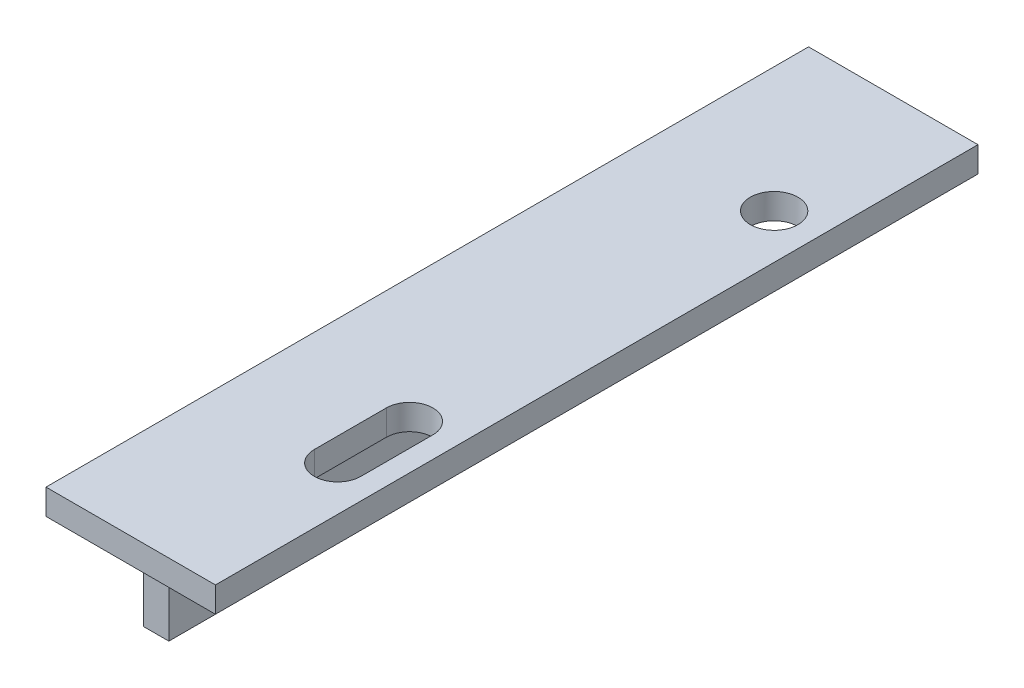
ISO-10303-21;
HEADER;
FILE_DESCRIPTION(('STEP AP214'),'2;1');
FILE_NAME('part.step','',(''),(''),'','','');
FILE_SCHEMA(('AUTOMOTIVE_DESIGN { 1 0 10303 214 1 1 1 1 }'));
ENDSEC;
DATA;
#1=APPLICATION_CONTEXT('core data for automotive mechanical design processes');
#2=APPLICATION_PROTOCOL_DEFINITION('international standard','automotive_design',2000,#1);
#3=PRODUCT_CONTEXT('',#1,'mechanical');
#4=PRODUCT('Part','Part','',(#3));
#5=PRODUCT_RELATED_PRODUCT_CATEGORY('part','',(#4));
#6=PRODUCT_DEFINITION_FORMATION('','',#4);
#7=PRODUCT_DEFINITION_CONTEXT('part definition',#1,'design');
#8=PRODUCT_DEFINITION('design','',#6,#7);
#9=PRODUCT_DEFINITION_SHAPE('','',#8);
#10=(LENGTH_UNIT() NAMED_UNIT(*) SI_UNIT(.MILLI.,.METRE.));
#11=(NAMED_UNIT(*) PLANE_ANGLE_UNIT() SI_UNIT($,.RADIAN.));
#12=(NAMED_UNIT(*) SI_UNIT($,.STERADIAN.) SOLID_ANGLE_UNIT());
#13=UNCERTAINTY_MEASURE_WITH_UNIT(LENGTH_MEASURE(1.E-05),#10,'distance_accuracy_value','');
#14=(GEOMETRIC_REPRESENTATION_CONTEXT(3) GLOBAL_UNCERTAINTY_ASSIGNED_CONTEXT((#13)) GLOBAL_UNIT_ASSIGNED_CONTEXT((#10,
#11,#12)) REPRESENTATION_CONTEXT('',''));
#15=CARTESIAN_POINT('',(0.,0.,0.));
#16=DIRECTION('',(0.,0.,1.));
#17=DIRECTION('',(1.,0.,0.));
#18=AXIS2_PLACEMENT_3D('',#15,#16,#17);
#19=CARTESIAN_POINT('',(0.,0.,-180.));
#20=DIRECTION('',(-1.,0.,0.));
#21=DIRECTION('',(0.,-1.,0.));
#22=AXIS2_PLACEMENT_3D('',#19,#20,#21);
#23=PLANE('',#22);
#24=DIRECTION('',(0.,0.,-1.));
#25=VECTOR('',#24,1.);
#26=CARTESIAN_POINT('',(0.,-6.,-180.));
#27=LINE('',#26,#25);
#28=CARTESIAN_POINT('',(0.,-6.,0.));
#29=VERTEX_POINT('',#28);
#30=CARTESIAN_POINT('',(0.,-6.,-23.));
#31=VERTEX_POINT('',#30);
#32=EDGE_CURVE('E164',#29,#31,#27,.T.);
#33=ORIENTED_EDGE('',*,*,#32,.F.);
#34=DIRECTION('',(0.,-1.,0.));
#35=VECTOR('',#34,1.);
#36=CARTESIAN_POINT('',(0.,0.,0.));
#37=LINE('',#36,#35);
#38=CARTESIAN_POINT('',(0.,0.,0.));
#39=VERTEX_POINT('',#38);
#40=EDGE_CURVE('E180',#39,#29,#37,.T.);
#41=ORIENTED_EDGE('',*,*,#40,.F.);
#42=DIRECTION('',(0.,0.,1.));
#43=VECTOR('',#42,1.);
#44=CARTESIAN_POINT('',(0.,0.,-180.));
#45=LINE('',#44,#43);
#46=CARTESIAN_POINT('',(0.,0.,-180.));
#47=VERTEX_POINT('',#46);
#48=EDGE_CURVE('E205',#47,#39,#45,.T.);
#49=ORIENTED_EDGE('',*,*,#48,.F.);
#50=DIRECTION('',(0.,-1.,0.));
#51=VECTOR('',#50,1.);
#52=CARTESIAN_POINT('',(0.,0.,-180.));
#53=LINE('',#52,#51);
#54=CARTESIAN_POINT('',(0.,-6.,-180.));
#55=VERTEX_POINT('',#54);
#56=EDGE_CURVE('E181',#47,#55,#53,.T.);
#57=ORIENTED_EDGE('',*,*,#56,.T.);
#58=DIRECTION('',(0.,0.,-1.));
#59=VECTOR('',#58,1.);
#60=CARTESIAN_POINT('',(0.,-6.,-180.));
#61=LINE('',#60,#59);
#62=CARTESIAN_POINT('',(0.,-6.,-157.));
#63=VERTEX_POINT('',#62);
#64=EDGE_CURVE('E173',#63,#55,#61,.T.);
#65=ORIENTED_EDGE('',*,*,#64,.F.);
#66=DIRECTION('',(0.,1.,0.));
#67=VECTOR('',#66,1.);
#68=CARTESIAN_POINT('',(0.,0.,-157.));
#69=LINE('',#68,#67);
#70=CARTESIAN_POINT('',(0.,-40.,-157.));
#71=VERTEX_POINT('',#70);
#72=EDGE_CURVE('E176',#71,#63,#69,.T.);
#73=ORIENTED_EDGE('',*,*,#72,.F.);
#74=DIRECTION('',(0.,0.,1.));
#75=VECTOR('',#74,1.);
#76=CARTESIAN_POINT('',(0.,-40.,-180.));
#77=LINE('',#76,#75);
#78=CARTESIAN_POINT('',(0.,-40.,-23.));
#79=VERTEX_POINT('',#78);
#80=EDGE_CURVE('E194',#71,#79,#77,.T.);
#81=ORIENTED_EDGE('',*,*,#80,.T.);
#82=DIRECTION('',(0.,-1.,0.));
#83=VECTOR('',#82,1.);
#84=CARTESIAN_POINT('',(0.,0.,-23.));
#85=LINE('',#84,#83);
#86=EDGE_CURVE('E178',#31,#79,#85,.T.);
#87=ORIENTED_EDGE('',*,*,#86,.F.);
#88=EDGE_LOOP('',(#33,#41,#49,#57,#65,#73,#81,#87));
#89=FACE_BOUND('',#88,.T.);
#90=ADVANCED_FACE('F41',(#89),#23,.T.);
#91=CARTESIAN_POINT('',(0.,0.,-180.));
#92=DIRECTION('',(0.,1.,0.));
#93=DIRECTION('',(0.,0.,1.));
#94=AXIS2_PLACEMENT_3D('',#91,#92,#93);
#95=PLANE('',#94);
#96=CARTESIAN_POINT('',(29.48,0.,-142.4));
#97=DIRECTION('',(0.,1.,0.));
#98=DIRECTION('',(0.,0.,1.));
#99=AXIS2_PLACEMENT_3D('',#96,#97,#98);
#100=CIRCLE('',#99,5.625);
#101=CARTESIAN_POINT('',(29.48,0.,-136.775));
#102=VERTEX_POINT('',#101);
#103=EDGE_CURVE('E150',#102,#102,#100,.T.);
#104=ORIENTED_EDGE('',*,*,#103,.F.);
#105=EDGE_LOOP('',(#104));
#106=FACE_BOUND('',#105,.T.);
#107=CARTESIAN_POINT('',(29.48,0.,-56.35));
#108=DIRECTION('',(0.,1.,0.));
#109=DIRECTION('',(0.,0.,1.));
#110=AXIS2_PLACEMENT_3D('',#107,#108,#109);
#111=CIRCLE('',#110,5.5);
#112=CARTESIAN_POINT('',(34.98,0.,-56.35));
#113=VERTEX_POINT('',#112);
#114=CARTESIAN_POINT('',(23.98,0.,-56.35));
#115=VERTEX_POINT('',#114);
#116=EDGE_CURVE('E56',#113,#115,#111,.T.);
#117=ORIENTED_EDGE('',*,*,#116,.F.);
#118=DIRECTION('',(0.,0.,-1.));
#119=VECTOR('',#118,1.);
#120=CARTESIAN_POINT('',(34.98,0.,-56.35));
#121=LINE('',#120,#119);
#122=CARTESIAN_POINT('',(34.98,0.,-39.35));
#123=VERTEX_POINT('',#122);
#124=EDGE_CURVE('E137',#123,#113,#121,.T.);
#125=ORIENTED_EDGE('',*,*,#124,.F.);
#126=CARTESIAN_POINT('',(29.48,0.,-39.35));
#127=DIRECTION('',(0.,1.,0.));
#128=DIRECTION('',(0.,0.,1.));
#129=AXIS2_PLACEMENT_3D('',#126,#127,#128);
#130=CIRCLE('',#129,5.5);
#131=CARTESIAN_POINT('',(23.98,0.,-39.35));
#132=VERTEX_POINT('',#131);
#133=EDGE_CURVE('E143',#132,#123,#130,.T.);
#134=ORIENTED_EDGE('',*,*,#133,.F.);
#135=DIRECTION('',(0.,0.,1.));
#136=VECTOR('',#135,1.);
#137=CARTESIAN_POINT('',(23.98,0.,-56.35));
#138=LINE('',#137,#136);
#139=EDGE_CURVE('E149',#115,#132,#138,.T.);
#140=ORIENTED_EDGE('',*,*,#139,.F.);
#141=EDGE_LOOP('',(#117,#125,#134,#140));
#142=FACE_BOUND('',#141,.T.);
#143=DIRECTION('',(-1.,0.,0.));
#144=VECTOR('',#143,1.);
#145=CARTESIAN_POINT('',(0.,0.,0.));
#146=LINE('',#145,#144);
#147=CARTESIAN_POINT('',(40.,0.,0.));
#148=VERTEX_POINT('',#147);
#149=EDGE_CURVE('E185',#148,#39,#146,.T.);
#150=ORIENTED_EDGE('',*,*,#149,.F.);
#151=DIRECTION('',(0.,0.,1.));
#152=VECTOR('',#151,1.);
#153=CARTESIAN_POINT('',(40.,0.,-180.));
#154=LINE('',#153,#152);
#155=CARTESIAN_POINT('',(40.,0.,-180.));
#156=VERTEX_POINT('',#155);
#157=EDGE_CURVE('E208',#156,#148,#154,.T.);
#158=ORIENTED_EDGE('',*,*,#157,.F.);
#159=DIRECTION('',(-1.,0.,0.));
#160=VECTOR('',#159,1.);
#161=CARTESIAN_POINT('',(0.,0.,-180.));
#162=LINE('',#161,#160);
#163=EDGE_CURVE('E191',#156,#47,#162,.T.);
#164=ORIENTED_EDGE('',*,*,#163,.T.);
#165=ORIENTED_EDGE('',*,*,#48,.T.);
#166=EDGE_LOOP('',(#150,#158,#164,#165));
#167=FACE_BOUND('',#166,.T.);
#168=ADVANCED_FACE('F147',(#106,#142,#167),#95,.T.);
#169=CARTESIAN_POINT('',(40.,0.,-180.));
#170=DIRECTION('',(1.,0.,0.));
#171=DIRECTION('',(0.,0.,-1.));
#172=AXIS2_PLACEMENT_3D('',#169,#170,#171);
#173=PLANE('',#172);
#174=DIRECTION('',(0.,1.,0.));
#175=VECTOR('',#174,1.);
#176=CARTESIAN_POINT('',(40.,0.,0.));
#177=LINE('',#176,#175);
#178=CARTESIAN_POINT('',(40.,-6.,0.));
#179=VERTEX_POINT('',#178);
#180=EDGE_CURVE('E200',#179,#148,#177,.T.);
#181=ORIENTED_EDGE('',*,*,#180,.F.);
#182=DIRECTION('',(0.,0.,1.));
#183=VECTOR('',#182,1.);
#184=CARTESIAN_POINT('',(40.,-6.,-180.));
#185=LINE('',#184,#183);
#186=CARTESIAN_POINT('',(40.,-6.,-180.));
#187=VERTEX_POINT('',#186);
#188=EDGE_CURVE('E210',#187,#179,#185,.T.);
#189=ORIENTED_EDGE('',*,*,#188,.F.);
#190=DIRECTION('',(0.,1.,0.));
#191=VECTOR('',#190,1.);
#192=CARTESIAN_POINT('',(40.,0.,-180.));
#193=LINE('',#192,#191);
#194=EDGE_CURVE('E188',#187,#156,#193,.T.);
#195=ORIENTED_EDGE('',*,*,#194,.T.);
#196=ORIENTED_EDGE('',*,*,#157,.T.);
#197=EDGE_LOOP('',(#181,#189,#195,#196));
#198=FACE_BOUND('',#197,.T.);
#199=ADVANCED_FACE('F252',(#198),#173,.T.);
#200=CARTESIAN_POINT('',(6.,-6.,-180.));
#201=DIRECTION('',(0.,-1.,0.));
#202=DIRECTION('',(0.,0.,-1.));
#203=AXIS2_PLACEMENT_3D('',#200,#201,#202);
#204=PLANE('',#203);
#205=CARTESIAN_POINT('',(29.48,-6.,-142.4));
#206=DIRECTION('',(0.,-1.,0.));
#207=DIRECTION('',(0.,0.,-1.));
#208=AXIS2_PLACEMENT_3D('',#205,#206,#207);
#209=CIRCLE('',#208,5.625);
#210=CARTESIAN_POINT('',(29.48,-6.,-148.025));
#211=VERTEX_POINT('',#210);
#212=EDGE_CURVE('E44',#211,#211,#209,.T.);
#213=ORIENTED_EDGE('',*,*,#212,.F.);
#214=EDGE_LOOP('',(#213));
#215=FACE_BOUND('',#214,.T.);
#216=CARTESIAN_POINT('',(29.48,-6.,-56.35));
#217=DIRECTION('',(0.,-1.,0.));
#218=DIRECTION('',(0.,0.,-1.));
#219=AXIS2_PLACEMENT_3D('',#216,#217,#218);
#220=CIRCLE('',#219,5.5);
#221=CARTESIAN_POINT('',(23.98,-6.,-56.35));
#222=VERTEX_POINT('',#221);
#223=CARTESIAN_POINT('',(34.98,-6.,-56.35));
#224=VERTEX_POINT('',#223);
#225=EDGE_CURVE('E11',#222,#224,#220,.T.);
#226=ORIENTED_EDGE('',*,*,#225,.F.);
#227=DIRECTION('',(0.,0.,-1.));
#228=VECTOR('',#227,1.);
#229=CARTESIAN_POINT('',(23.98,-6.,-180.));
#230=LINE('',#229,#228);
#231=CARTESIAN_POINT('',(23.98,-6.,-39.35));
#232=VERTEX_POINT('',#231);
#233=EDGE_CURVE('E207',#232,#222,#230,.T.);
#234=ORIENTED_EDGE('',*,*,#233,.F.);
#235=CARTESIAN_POINT('',(29.48,-6.,-39.35));
#236=DIRECTION('',(0.,-1.,0.));
#237=DIRECTION('',(0.,0.,-1.));
#238=AXIS2_PLACEMENT_3D('',#235,#236,#237);
#239=CIRCLE('',#238,5.5);
#240=CARTESIAN_POINT('',(34.98,-6.,-39.35));
#241=VERTEX_POINT('',#240);
#242=EDGE_CURVE('E221',#241,#232,#239,.T.);
#243=ORIENTED_EDGE('',*,*,#242,.F.);
#244=DIRECTION('',(0.,0.,1.));
#245=VECTOR('',#244,1.);
#246=CARTESIAN_POINT('',(34.98,-6.,-180.));
#247=LINE('',#246,#245);
#248=EDGE_CURVE('E49',#224,#241,#247,.T.);
#249=ORIENTED_EDGE('',*,*,#248,.F.);
#250=EDGE_LOOP('',(#226,#234,#243,#249));
#251=FACE_BOUND('',#250,.T.);
#252=DIRECTION('',(1.,0.,0.));
#253=VECTOR('',#252,1.);
#254=CARTESIAN_POINT('',(6.,-6.,0.));
#255=LINE('',#254,#253);
#256=EDGE_CURVE('E197',#29,#179,#255,.T.);
#257=ORIENTED_EDGE('',*,*,#256,.F.);
#258=ORIENTED_EDGE('',*,*,#32,.T.);
#259=DIRECTION('',(1.,0.,0.));
#260=VECTOR('',#259,1.);
#261=CARTESIAN_POINT('',(-4.,-6.,-23.));
#262=LINE('',#261,#260);
#263=CARTESIAN_POINT('',(6.,-6.,-23.));
#264=VERTEX_POINT('',#263);
#265=EDGE_CURVE('E162',#31,#264,#262,.T.);
#266=ORIENTED_EDGE('',*,*,#265,.T.);
#267=DIRECTION('',(0.,0.,1.));
#268=VECTOR('',#267,1.);
#269=CARTESIAN_POINT('',(6.,-6.,-180.));
#270=LINE('',#269,#268);
#271=CARTESIAN_POINT('',(6.,-6.,-157.));
#272=VERTEX_POINT('',#271);
#273=EDGE_CURVE('E212',#272,#264,#270,.T.);
#274=ORIENTED_EDGE('',*,*,#273,.F.);
#275=DIRECTION('',(1.,0.,0.));
#276=VECTOR('',#275,1.);
#277=CARTESIAN_POINT('',(-4.,-6.,-157.));
#278=LINE('',#277,#276);
#279=EDGE_CURVE('E166',#63,#272,#278,.T.);
#280=ORIENTED_EDGE('',*,*,#279,.F.);
#281=ORIENTED_EDGE('',*,*,#64,.T.);
#282=DIRECTION('',(1.,0.,0.));
#283=VECTOR('',#282,1.);
#284=CARTESIAN_POINT('',(6.,-6.,-180.));
#285=LINE('',#284,#283);
#286=EDGE_CURVE('E184',#55,#187,#285,.T.);
#287=ORIENTED_EDGE('',*,*,#286,.T.);
#288=ORIENTED_EDGE('',*,*,#188,.T.);
#289=EDGE_LOOP('',(#257,#258,#266,#274,#280,#281,#287,#288));
#290=FACE_BOUND('',#289,.T.);
#291=ADVANCED_FACE('F229',(#215,#251,#290),#204,.T.);
#292=CARTESIAN_POINT('',(6.,-6.,-180.));
#293=DIRECTION('',(1.,0.,0.));
#294=DIRECTION('',(0.,0.,-1.));
#295=AXIS2_PLACEMENT_3D('',#292,#293,#294);
#296=PLANE('',#295);
#297=DIRECTION('',(0.,1.,0.));
#298=VECTOR('',#297,1.);
#299=CARTESIAN_POINT('',(6.,-6.,-23.));
#300=LINE('',#299,#298);
#301=CARTESIAN_POINT('',(6.,-40.,-23.));
#302=VERTEX_POINT('',#301);
#303=EDGE_CURVE('E157',#302,#264,#300,.T.);
#304=ORIENTED_EDGE('',*,*,#303,.F.);
#305=DIRECTION('',(0.,0.,1.));
#306=VECTOR('',#305,1.);
#307=CARTESIAN_POINT('',(6.,-40.,-180.));
#308=LINE('',#307,#306);
#309=CARTESIAN_POINT('',(6.,-40.,-157.));
#310=VERTEX_POINT('',#309);
#311=EDGE_CURVE('E215',#310,#302,#308,.T.);
#312=ORIENTED_EDGE('',*,*,#311,.F.);
#313=DIRECTION('',(0.,-1.,0.));
#314=VECTOR('',#313,1.);
#315=CARTESIAN_POINT('',(6.,-6.,-157.));
#316=LINE('',#315,#314);
#317=EDGE_CURVE('E161',#272,#310,#316,.T.);
#318=ORIENTED_EDGE('',*,*,#317,.F.);
#319=ORIENTED_EDGE('',*,*,#273,.T.);
#320=EDGE_LOOP('',(#304,#312,#318,#319));
#321=FACE_BOUND('',#320,.T.);
#322=ADVANCED_FACE('F282',(#321),#296,.T.);
#323=CARTESIAN_POINT('',(6.,-40.,-180.));
#324=DIRECTION('',(0.,-1.,0.));
#325=DIRECTION('',(0.,0.,-1.));
#326=AXIS2_PLACEMENT_3D('',#323,#324,#325);
#327=PLANE('',#326);
#328=DIRECTION('',(1.,0.,0.));
#329=VECTOR('',#328,1.);
#330=CARTESIAN_POINT('',(-4.,-40.,-23.));
#331=LINE('',#330,#329);
#332=EDGE_CURVE('E160',#79,#302,#331,.T.);
#333=ORIENTED_EDGE('',*,*,#332,.F.);
#334=ORIENTED_EDGE('',*,*,#80,.F.);
#335=DIRECTION('',(1.,0.,0.));
#336=VECTOR('',#335,1.);
#337=CARTESIAN_POINT('',(-4.,-40.,-157.));
#338=LINE('',#337,#336);
#339=EDGE_CURVE('E168',#71,#310,#338,.T.);
#340=ORIENTED_EDGE('',*,*,#339,.T.);
#341=ORIENTED_EDGE('',*,*,#311,.T.);
#342=EDGE_LOOP('',(#333,#334,#340,#341));
#343=FACE_BOUND('',#342,.T.);
#344=ADVANCED_FACE('F276',(#343),#327,.T.);
#345=CARTESIAN_POINT('',(0.,0.,-180.));
#346=DIRECTION('',(0.,0.,-1.));
#347=DIRECTION('',(-1.,0.,0.));
#348=AXIS2_PLACEMENT_3D('',#345,#346,#347);
#349=PLANE('',#348);
#350=ORIENTED_EDGE('',*,*,#286,.F.);
#351=ORIENTED_EDGE('',*,*,#56,.F.);
#352=ORIENTED_EDGE('',*,*,#163,.F.);
#353=ORIENTED_EDGE('',*,*,#194,.F.);
#354=EDGE_LOOP('',(#350,#351,#352,#353));
#355=FACE_BOUND('',#354,.T.);
#356=ADVANCED_FACE('F267',(#355),#349,.T.);
#357=CARTESIAN_POINT('',(0.,0.,0.));
#358=DIRECTION('',(0.,0.,-1.));
#359=DIRECTION('',(-1.,0.,0.));
#360=AXIS2_PLACEMENT_3D('',#357,#358,#359);
#361=PLANE('',#360);
#362=ORIENTED_EDGE('',*,*,#40,.T.);
#363=ORIENTED_EDGE('',*,*,#256,.T.);
#364=ORIENTED_EDGE('',*,*,#180,.T.);
#365=ORIENTED_EDGE('',*,*,#149,.T.);
#366=EDGE_LOOP('',(#362,#363,#364,#365));
#367=FACE_BOUND('',#366,.T.);
#368=ADVANCED_FACE('F260',(#367),#361,.F.);
#369=CARTESIAN_POINT('',(-4.,-6.,-23.));
#370=DIRECTION('',(0.,0.,-1.));
#371=DIRECTION('',(0.,1.,0.));
#372=AXIS2_PLACEMENT_3D('',#369,#370,#371);
#373=PLANE('',#372);
#374=ORIENTED_EDGE('',*,*,#86,.T.);
#375=ORIENTED_EDGE('',*,*,#332,.T.);
#376=ORIENTED_EDGE('',*,*,#303,.T.);
#377=ORIENTED_EDGE('',*,*,#265,.F.);
#378=EDGE_LOOP('',(#374,#375,#376,#377));
#379=FACE_BOUND('',#378,.T.);
#380=ADVANCED_FACE('F280',(#379),#373,.F.);
#381=CARTESIAN_POINT('',(-4.,-6.,-157.));
#382=DIRECTION('',(0.,0.,1.));
#383=DIRECTION('',(1.,0.,0.));
#384=AXIS2_PLACEMENT_3D('',#381,#382,#383);
#385=PLANE('',#384);
#386=ORIENTED_EDGE('',*,*,#72,.T.);
#387=ORIENTED_EDGE('',*,*,#279,.T.);
#388=ORIENTED_EDGE('',*,*,#317,.T.);
#389=ORIENTED_EDGE('',*,*,#339,.F.);
#390=EDGE_LOOP('',(#386,#387,#388,#389));
#391=FACE_BOUND('',#390,.T.);
#392=ADVANCED_FACE('F284',(#391),#385,.F.);
#393=CARTESIAN_POINT('',(29.48,-10.,-56.35));
#394=DIRECTION('',(0.,1.,0.));
#395=DIRECTION('',(0.,0.,1.));
#396=AXIS2_PLACEMENT_3D('',#393,#394,#395);
#397=CYLINDRICAL_SURFACE('',#396,5.5);
#398=ORIENTED_EDGE('',*,*,#225,.T.);
#399=DIRECTION('',(0.,1.,0.));
#400=VECTOR('',#399,1.);
#401=CARTESIAN_POINT('',(34.98,-10.,-56.35));
#402=LINE('',#401,#400);
#403=EDGE_CURVE('E128',#224,#113,#402,.T.);
#404=ORIENTED_EDGE('',*,*,#403,.T.);
#405=ORIENTED_EDGE('',*,*,#116,.T.);
#406=DIRECTION('',(0.,1.,0.));
#407=VECTOR('',#406,1.);
#408=CARTESIAN_POINT('',(23.98,-10.,-56.35));
#409=LINE('',#408,#407);
#410=EDGE_CURVE('E144',#222,#115,#409,.T.);
#411=ORIENTED_EDGE('',*,*,#410,.F.);
#412=EDGE_LOOP('',(#398,#404,#405,#411));
#413=FACE_BOUND('',#412,.T.);
#414=ADVANCED_FACE('F130',(#413),#397,.F.);
#415=CARTESIAN_POINT('',(34.98,-10.,-56.35));
#416=DIRECTION('',(1.,0.,0.));
#417=DIRECTION('',(0.,0.,-1.));
#418=AXIS2_PLACEMENT_3D('',#415,#416,#417);
#419=PLANE('',#418);
#420=ORIENTED_EDGE('',*,*,#248,.T.);
#421=DIRECTION('',(0.,1.,0.));
#422=VECTOR('',#421,1.);
#423=CARTESIAN_POINT('',(34.98,-10.,-39.35));
#424=LINE('',#423,#422);
#425=EDGE_CURVE('E134',#241,#123,#424,.T.);
#426=ORIENTED_EDGE('',*,*,#425,.T.);
#427=ORIENTED_EDGE('',*,*,#124,.T.);
#428=ORIENTED_EDGE('',*,*,#403,.F.);
#429=EDGE_LOOP('',(#420,#426,#427,#428));
#430=FACE_BOUND('',#429,.T.);
#431=ADVANCED_FACE('F138',(#430),#419,.F.);
#432=CARTESIAN_POINT('',(29.48,-10.,-39.35));
#433=DIRECTION('',(0.,1.,0.));
#434=DIRECTION('',(0.,0.,1.));
#435=AXIS2_PLACEMENT_3D('',#432,#433,#434);
#436=CYLINDRICAL_SURFACE('',#435,5.5);
#437=ORIENTED_EDGE('',*,*,#242,.T.);
#438=DIRECTION('',(0.,1.,0.));
#439=VECTOR('',#438,1.);
#440=CARTESIAN_POINT('',(23.98,-10.,-39.35));
#441=LINE('',#440,#439);
#442=EDGE_CURVE('E64',#232,#132,#441,.T.);
#443=ORIENTED_EDGE('',*,*,#442,.T.);
#444=ORIENTED_EDGE('',*,*,#133,.T.);
#445=ORIENTED_EDGE('',*,*,#425,.F.);
#446=EDGE_LOOP('',(#437,#443,#444,#445));
#447=FACE_BOUND('',#446,.T.);
#448=ADVANCED_FACE('F226',(#447),#436,.F.);
#449=CARTESIAN_POINT('',(23.98,-10.,-56.35));
#450=DIRECTION('',(-1.,0.,0.));
#451=DIRECTION('',(0.,0.,1.));
#452=AXIS2_PLACEMENT_3D('',#449,#450,#451);
#453=PLANE('',#452);
#454=ORIENTED_EDGE('',*,*,#233,.T.);
#455=ORIENTED_EDGE('',*,*,#410,.T.);
#456=ORIENTED_EDGE('',*,*,#139,.T.);
#457=ORIENTED_EDGE('',*,*,#442,.F.);
#458=EDGE_LOOP('',(#454,#455,#456,#457));
#459=FACE_BOUND('',#458,.T.);
#460=ADVANCED_FACE('F231',(#459),#453,.F.);
#461=CARTESIAN_POINT('',(29.48,-10.,-142.4));
#462=DIRECTION('',(0.,1.,0.));
#463=DIRECTION('',(0.,0.,1.));
#464=AXIS2_PLACEMENT_3D('',#461,#462,#463);
#465=CYLINDRICAL_SURFACE('',#464,5.625);
#466=ORIENTED_EDGE('',*,*,#212,.T.);
#467=EDGE_LOOP('',(#466));
#468=FACE_BOUND('',#467,.T.);
#469=ORIENTED_EDGE('',*,*,#103,.T.);
#470=EDGE_LOOP('',(#469));
#471=FACE_BOUND('',#470,.T.);
#472=ADVANCED_FACE('F235',(#468,#471),#465,.F.);
#473=CLOSED_SHELL('',(#90,#168,#199,#291,#322,#344,#356,#368,#380,#392,#414,#431,#448,#460,#472));
#474=MANIFOLD_SOLID_BREP('B2',#473);
#475=ADVANCED_BREP_SHAPE_REPRESENTATION('',(#18,#474),#14);
#476=SHAPE_DEFINITION_REPRESENTATION(#9,#475);
ENDSEC;
END-ISO-10303-21;
